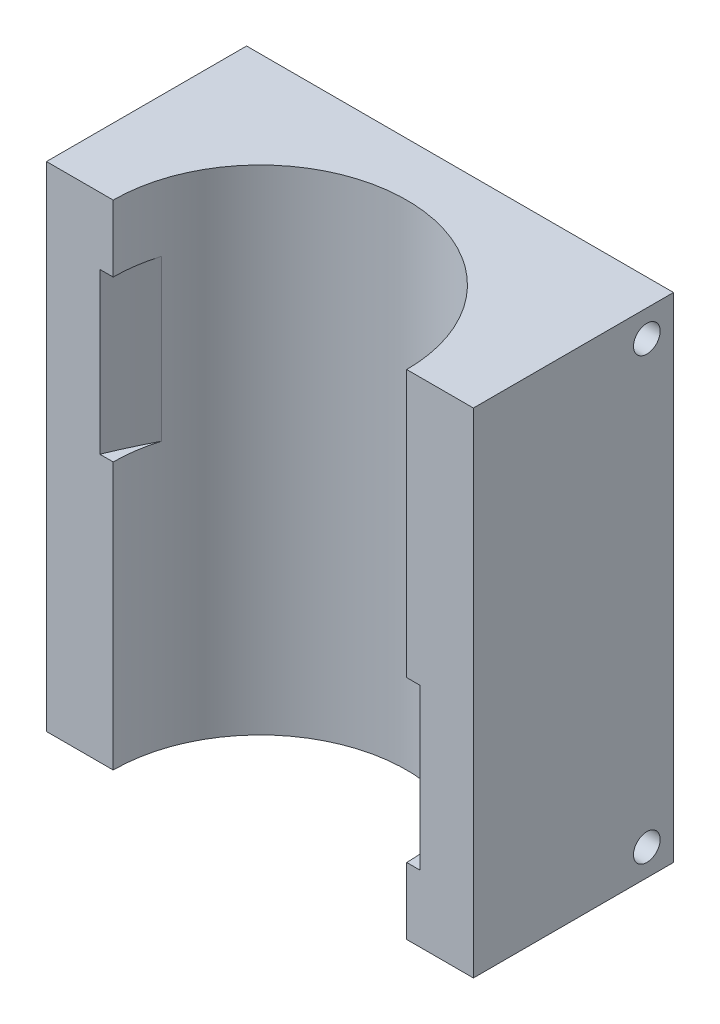
ISO-10303-21;
HEADER;
FILE_DESCRIPTION(('STEP AP214'),'2;1');
FILE_NAME('part.step','',(''),(''),'','','');
FILE_SCHEMA(('AUTOMOTIVE_DESIGN { 1 0 10303 214 1 1 1 1 }'));
ENDSEC;
DATA;
#1=APPLICATION_CONTEXT('core data for automotive mechanical design processes');
#2=APPLICATION_PROTOCOL_DEFINITION('international standard','automotive_design',2000,#1);
#3=PRODUCT_CONTEXT('',#1,'mechanical');
#4=PRODUCT('Part','Part','',(#3));
#5=PRODUCT_RELATED_PRODUCT_CATEGORY('part','',(#4));
#6=PRODUCT_DEFINITION_FORMATION('','',#4);
#7=PRODUCT_DEFINITION_CONTEXT('part definition',#1,'design');
#8=PRODUCT_DEFINITION('design','',#6,#7);
#9=PRODUCT_DEFINITION_SHAPE('','',#8);
#10=(LENGTH_UNIT() NAMED_UNIT(*) SI_UNIT(.MILLI.,.METRE.));
#11=(NAMED_UNIT(*) PLANE_ANGLE_UNIT() SI_UNIT($,.RADIAN.));
#12=(NAMED_UNIT(*) SI_UNIT($,.STERADIAN.) SOLID_ANGLE_UNIT());
#13=UNCERTAINTY_MEASURE_WITH_UNIT(LENGTH_MEASURE(1.E-05),#10,'distance_accuracy_value','');
#14=(GEOMETRIC_REPRESENTATION_CONTEXT(3) GLOBAL_UNCERTAINTY_ASSIGNED_CONTEXT((#13)) GLOBAL_UNIT_ASSIGNED_CONTEXT((#10,
#11,#12)) REPRESENTATION_CONTEXT('',''));
#15=CARTESIAN_POINT('',(0.,0.,0.));
#16=DIRECTION('',(0.,0.,1.));
#17=DIRECTION('',(1.,0.,0.));
#18=AXIS2_PLACEMENT_3D('',#15,#16,#17);
#19=CARTESIAN_POINT('',(0.,30.,-40.));
#20=DIRECTION('',(0.,-1.,0.));
#21=DIRECTION('',(0.,0.,-1.));
#22=AXIS2_PLACEMENT_3D('',#19,#20,#21);
#23=CYLINDRICAL_SURFACE('',#22,11.);
#24=DIRECTION('',(0.,-1.,0.));
#25=VECTOR('',#24,1.);
#26=CARTESIAN_POINT('',(11.,30.,-40.));
#27=LINE('',#26,#25);
#28=CARTESIAN_POINT('',(11.,33.5,-40.));
#29=VERTEX_POINT('',#28);
#30=CARTESIAN_POINT('',(11.,13.5,-40.));
#31=VERTEX_POINT('',#30);
#32=EDGE_CURVE('E192',#29,#31,#27,.T.);
#33=ORIENTED_EDGE('',*,*,#32,.F.);
#34=CARTESIAN_POINT('',(0.,33.5,-40.));
#35=DIRECTION('',(0.,1.,0.));
#36=DIRECTION('',(0.,0.,1.));
#37=AXIS2_PLACEMENT_3D('',#34,#35,#36);
#38=CIRCLE('',#37,11.);
#39=CARTESIAN_POINT('',(-11.,33.5,-40.));
#40=VERTEX_POINT('',#39);
#41=EDGE_CURVE('E146',#29,#40,#38,.T.);
#42=ORIENTED_EDGE('',*,*,#41,.T.);
#43=DIRECTION('',(0.,-1.,0.));
#44=VECTOR('',#43,1.);
#45=CARTESIAN_POINT('',(-11.,30.,-40.));
#46=LINE('',#45,#44);
#47=CARTESIAN_POINT('',(-11.,28.5,-40.));
#48=VERTEX_POINT('',#47);
#49=EDGE_CURVE('E125',#48,#40,#46,.F.);
#50=ORIENTED_EDGE('',*,*,#49,.F.);
#51=CARTESIAN_POINT('',(0.,28.5,-40.));
#52=DIRECTION('',(0.,1.,0.));
#53=DIRECTION('',(0.,0.,1.));
#54=AXIS2_PLACEMENT_3D('',#51,#52,#53);
#55=CIRCLE('',#54,11.);
#56=CARTESIAN_POINT('',(-10.5410845469893,28.5,-43.1441273150468));
#57=VERTEX_POINT('',#56);
#58=EDGE_CURVE('E171',#57,#48,#55,.T.);
#59=ORIENTED_EDGE('',*,*,#58,.F.);
#60=DIRECTION('',(0.,1.,0.));
#61=VECTOR('',#60,1.);
#62=CARTESIAN_POINT('',(-10.5410845469893,16.5,-43.1441273150468));
#63=LINE('',#62,#61);
#64=CARTESIAN_POINT('',(-10.5410845469893,16.5,-43.1441273150468));
#65=VERTEX_POINT('',#64);
#66=EDGE_CURVE('E166',#65,#57,#63,.T.);
#67=ORIENTED_EDGE('',*,*,#66,.F.);
#68=CARTESIAN_POINT('',(0.,16.5,-40.));
#69=DIRECTION('',(0.,1.,0.));
#70=DIRECTION('',(0.,0.,1.));
#71=AXIS2_PLACEMENT_3D('',#68,#69,#70);
#72=CIRCLE('',#71,11.);
#73=CARTESIAN_POINT('',(-11.,16.5,-40.));
#74=VERTEX_POINT('',#73);
#75=EDGE_CURVE('E174',#65,#74,#72,.T.);
#76=ORIENTED_EDGE('',*,*,#75,.T.);
#77=CARTESIAN_POINT('',(-11.,-3.50000000000001,-40.));
#78=VERTEX_POINT('',#77);
#79=EDGE_CURVE('E207',#78,#74,#46,.F.);
#80=ORIENTED_EDGE('',*,*,#79,.F.);
#81=CARTESIAN_POINT('',(0.,-3.50000000000001,-40.));
#82=DIRECTION('',(0.,-1.,0.));
#83=DIRECTION('',(0.,0.,-1.));
#84=AXIS2_PLACEMENT_3D('',#81,#82,#83);
#85=CIRCLE('',#84,11.);
#86=CARTESIAN_POINT('',(11.,-3.50000000000001,-40.));
#87=VERTEX_POINT('',#86);
#88=EDGE_CURVE('E188',#78,#87,#85,.T.);
#89=ORIENTED_EDGE('',*,*,#88,.T.);
#90=CARTESIAN_POINT('',(11.,1.5,-40.));
#91=VERTEX_POINT('',#90);
#92=EDGE_CURVE('E50',#91,#87,#27,.T.);
#93=ORIENTED_EDGE('',*,*,#92,.F.);
#94=CARTESIAN_POINT('',(0.,1.5,-40.));
#95=DIRECTION('',(0.,-1.,0.));
#96=DIRECTION('',(0.,0.,-1.));
#97=AXIS2_PLACEMENT_3D('',#94,#95,#96);
#98=CIRCLE('',#97,11.);
#99=CARTESIAN_POINT('',(10.5410845469893,1.5,-43.1441273150468));
#100=VERTEX_POINT('',#99);
#101=EDGE_CURVE('E43',#100,#91,#98,.T.);
#102=ORIENTED_EDGE('',*,*,#101,.F.);
#103=DIRECTION('',(0.,-1.,0.));
#104=VECTOR('',#103,1.);
#105=CARTESIAN_POINT('',(10.5410845469893,13.5,-43.1441273150468));
#106=LINE('',#105,#104);
#107=CARTESIAN_POINT('',(10.5410845469893,13.5,-43.1441273150468));
#108=VERTEX_POINT('',#107);
#109=EDGE_CURVE('E157',#108,#100,#106,.T.);
#110=ORIENTED_EDGE('',*,*,#109,.F.);
#111=CARTESIAN_POINT('',(0.,13.5,-40.));
#112=DIRECTION('',(0.,-1.,0.));
#113=DIRECTION('',(0.,0.,-1.));
#114=AXIS2_PLACEMENT_3D('',#111,#112,#113);
#115=CIRCLE('',#114,11.);
#116=EDGE_CURVE('E11',#108,#31,#115,.T.);
#117=ORIENTED_EDGE('',*,*,#116,.T.);
#118=EDGE_LOOP('',(#33,#42,#50,#59,#67,#76,#80,#89,#93,#102,#110,#117));
#119=FACE_BOUND('',#118,.T.);
#120=ADVANCED_FACE('F35',(#119),#23,.F.);
#121=CARTESIAN_POINT('',(-16.,30.,-53.5));
#122=DIRECTION('',(1.,0.,0.));
#123=DIRECTION('',(0.,0.,-1.));
#124=AXIS2_PLACEMENT_3D('',#121,#122,#123);
#125=PLANE('',#124);
#126=CARTESIAN_POINT('',(-16.,-1.50000000000001,-53.));
#127=DIRECTION('',(1.,0.,0.));
#128=DIRECTION('',(0.,0.,-1.));
#129=AXIS2_PLACEMENT_3D('',#126,#127,#128);
#130=CIRCLE('',#129,0.999999999999998);
#131=CARTESIAN_POINT('',(-16.,-1.50000000000001,-54.));
#132=VERTEX_POINT('',#131);
#133=EDGE_CURVE('E209',#132,#132,#130,.T.);
#134=ORIENTED_EDGE('',*,*,#133,.T.);
#135=EDGE_LOOP('',(#134));
#136=FACE_BOUND('',#135,.T.);
#137=CARTESIAN_POINT('',(-16.,31.5,-53.));
#138=DIRECTION('',(1.,0.,0.));
#139=DIRECTION('',(0.,0.,-1.));
#140=AXIS2_PLACEMENT_3D('',#137,#138,#139);
#141=CIRCLE('',#140,0.999999999999998);
#142=CARTESIAN_POINT('',(-16.,31.5,-54.));
#143=VERTEX_POINT('',#142);
#144=EDGE_CURVE('E216',#143,#143,#141,.T.);
#145=ORIENTED_EDGE('',*,*,#144,.T.);
#146=EDGE_LOOP('',(#145));
#147=FACE_BOUND('',#146,.T.);
#148=DIRECTION('',(0.,0.,-1.));
#149=VECTOR('',#148,1.);
#150=CARTESIAN_POINT('',(-16.,-3.50000000000001,-26.5));
#151=LINE('',#150,#149);
#152=CARTESIAN_POINT('',(-16.,-3.50000000000001,-40.));
#153=VERTEX_POINT('',#152);
#154=CARTESIAN_POINT('',(-16.,-3.50000000000001,-55.));
#155=VERTEX_POINT('',#154);
#156=EDGE_CURVE('E137',#153,#155,#151,.T.);
#157=ORIENTED_EDGE('',*,*,#156,.F.);
#158=DIRECTION('',(0.,-1.,0.));
#159=VECTOR('',#158,1.);
#160=CARTESIAN_POINT('',(-16.,33.5,-40.));
#161=LINE('',#160,#159);
#162=CARTESIAN_POINT('',(-16.,33.5,-40.));
#163=VERTEX_POINT('',#162);
#164=EDGE_CURVE('E58',#163,#153,#161,.T.);
#165=ORIENTED_EDGE('',*,*,#164,.F.);
#166=DIRECTION('',(0.,0.,1.));
#167=VECTOR('',#166,1.);
#168=CARTESIAN_POINT('',(-16.,33.5,-53.5));
#169=LINE('',#168,#167);
#170=CARTESIAN_POINT('',(-16.,33.5,-55.));
#171=VERTEX_POINT('',#170);
#172=EDGE_CURVE('E135',#171,#163,#169,.T.);
#173=ORIENTED_EDGE('',*,*,#172,.F.);
#174=DIRECTION('',(0.,1.,0.));
#175=VECTOR('',#174,1.);
#176=CARTESIAN_POINT('',(-16.,-3.50000000000001,-55.));
#177=LINE('',#176,#175);
#178=EDGE_CURVE('E228',#155,#171,#177,.T.);
#179=ORIENTED_EDGE('',*,*,#178,.F.);
#180=EDGE_LOOP('',(#157,#165,#173,#179));
#181=FACE_BOUND('',#180,.T.);
#182=ADVANCED_FACE('F37',(#136,#147,#181),#125,.F.);
#183=CARTESIAN_POINT('',(16.,30.,-53.5));
#184=DIRECTION('',(-1.,0.,0.));
#185=DIRECTION('',(0.,0.,1.));
#186=AXIS2_PLACEMENT_3D('',#183,#184,#185);
#187=PLANE('',#186);
#188=CARTESIAN_POINT('',(16.,-1.50000000000001,-53.));
#189=DIRECTION('',(1.,0.,0.));
#190=DIRECTION('',(0.,0.,-1.));
#191=AXIS2_PLACEMENT_3D('',#188,#189,#190);
#192=CIRCLE('',#191,0.999999999999998);
#193=CARTESIAN_POINT('',(16.,-1.50000000000001,-54.));
#194=VERTEX_POINT('',#193);
#195=EDGE_CURVE('E213',#194,#194,#192,.T.);
#196=ORIENTED_EDGE('',*,*,#195,.F.);
#197=EDGE_LOOP('',(#196));
#198=FACE_BOUND('',#197,.T.);
#199=CARTESIAN_POINT('',(16.,31.5,-53.));
#200=DIRECTION('',(1.,0.,0.));
#201=DIRECTION('',(0.,0.,-1.));
#202=AXIS2_PLACEMENT_3D('',#199,#200,#201);
#203=CIRCLE('',#202,0.999999999999998);
#204=CARTESIAN_POINT('',(16.,31.5,-54.));
#205=VERTEX_POINT('',#204);
#206=EDGE_CURVE('E212',#205,#205,#203,.T.);
#207=ORIENTED_EDGE('',*,*,#206,.F.);
#208=EDGE_LOOP('',(#207));
#209=FACE_BOUND('',#208,.T.);
#210=DIRECTION('',(0.,0.,-1.));
#211=VECTOR('',#210,1.);
#212=CARTESIAN_POINT('',(16.,33.5,-26.5));
#213=LINE('',#212,#211);
#214=CARTESIAN_POINT('',(16.,33.5,-40.));
#215=VERTEX_POINT('',#214);
#216=CARTESIAN_POINT('',(16.,33.5,-55.));
#217=VERTEX_POINT('',#216);
#218=EDGE_CURVE('E145',#215,#217,#213,.T.);
#219=ORIENTED_EDGE('',*,*,#218,.F.);
#220=DIRECTION('',(0.,-1.,0.));
#221=VECTOR('',#220,1.);
#222=CARTESIAN_POINT('',(16.,33.5,-40.));
#223=LINE('',#222,#221);
#224=CARTESIAN_POINT('',(16.,-3.50000000000001,-40.));
#225=VERTEX_POINT('',#224);
#226=EDGE_CURVE('E138',#215,#225,#223,.T.);
#227=ORIENTED_EDGE('',*,*,#226,.T.);
#228=DIRECTION('',(0.,0.,1.));
#229=VECTOR('',#228,1.);
#230=CARTESIAN_POINT('',(16.,-3.50000000000001,-53.5));
#231=LINE('',#230,#229);
#232=CARTESIAN_POINT('',(16.,-3.50000000000001,-55.));
#233=VERTEX_POINT('',#232);
#234=EDGE_CURVE('E150',#233,#225,#231,.T.);
#235=ORIENTED_EDGE('',*,*,#234,.F.);
#236=DIRECTION('',(0.,-1.,0.));
#237=VECTOR('',#236,1.);
#238=CARTESIAN_POINT('',(16.,33.5,-55.));
#239=LINE('',#238,#237);
#240=EDGE_CURVE('E222',#217,#233,#239,.T.);
#241=ORIENTED_EDGE('',*,*,#240,.F.);
#242=EDGE_LOOP('',(#219,#227,#235,#241));
#243=FACE_BOUND('',#242,.T.);
#244=ADVANCED_FACE('F240',(#198,#209,#243),#187,.F.);
#245=CARTESIAN_POINT('',(24.9601132838557,16.5,-24.7141258886984));
#246=DIRECTION('',(0.,1.,0.));
#247=DIRECTION('',(0.,0.,1.));
#248=AXIS2_PLACEMENT_3D('',#245,#246,#247);
#249=CYLINDRICAL_SURFACE('',#248,40.);
#250=CARTESIAN_POINT('',(24.9601132838557,28.5,-24.7141258886984));
#251=DIRECTION('',(0.,1.,0.));
#252=DIRECTION('',(0.,0.,1.));
#253=AXIS2_PLACEMENT_3D('',#250,#251,#252);
#254=CIRCLE('',#253,40.);
#255=CARTESIAN_POINT('',(-12.0039510577915,28.5,-40.));
#256=VERTEX_POINT('',#255);
#257=EDGE_CURVE('E162',#57,#256,#254,.T.);
#258=ORIENTED_EDGE('',*,*,#257,.T.);
#259=DIRECTION('',(0.,1.,0.));
#260=VECTOR('',#259,1.);
#261=CARTESIAN_POINT('',(-12.0039510577915,16.5,-40.));
#262=LINE('',#261,#260);
#263=CARTESIAN_POINT('',(-12.0039510577915,16.5,-40.));
#264=VERTEX_POINT('',#263);
#265=EDGE_CURVE('E199',#256,#264,#262,.F.);
#266=ORIENTED_EDGE('',*,*,#265,.T.);
#267=CARTESIAN_POINT('',(24.9601132838557,16.5,-24.7141258886984));
#268=DIRECTION('',(0.,1.,0.));
#269=DIRECTION('',(0.,0.,1.));
#270=AXIS2_PLACEMENT_3D('',#267,#268,#269);
#271=CIRCLE('',#270,40.);
#272=EDGE_CURVE('E163',#65,#264,#271,.T.);
#273=ORIENTED_EDGE('',*,*,#272,.F.);
#274=ORIENTED_EDGE('',*,*,#66,.T.);
#275=EDGE_LOOP('',(#258,#266,#273,#274));
#276=FACE_BOUND('',#275,.T.);
#277=ADVANCED_FACE('F263',(#276),#249,.F.);
#278=CARTESIAN_POINT('',(24.9601132838557,16.5,-24.7141258886984));
#279=DIRECTION('',(0.,1.,0.));
#280=DIRECTION('',(0.,0.,1.));
#281=AXIS2_PLACEMENT_3D('',#278,#279,#280);
#282=PLANE('',#281);
#283=DIRECTION('',(-1.,0.,0.));
#284=VECTOR('',#283,1.);
#285=CARTESIAN_POINT('',(24.9601132838557,16.5,-40.));
#286=LINE('',#285,#284);
#287=EDGE_CURVE('E206',#74,#264,#286,.T.);
#288=ORIENTED_EDGE('',*,*,#287,.F.);
#289=ORIENTED_EDGE('',*,*,#75,.F.);
#290=ORIENTED_EDGE('',*,*,#272,.T.);
#291=EDGE_LOOP('',(#288,#289,#290));
#292=FACE_BOUND('',#291,.T.);
#293=ADVANCED_FACE('F270',(#292),#282,.T.);
#294=CARTESIAN_POINT('',(24.9601132838557,28.5,-24.7141258886984));
#295=DIRECTION('',(0.,1.,0.));
#296=DIRECTION('',(0.,0.,1.));
#297=AXIS2_PLACEMENT_3D('',#294,#295,#296);
#298=PLANE('',#297);
#299=ORIENTED_EDGE('',*,*,#58,.T.);
#300=DIRECTION('',(-1.,0.,0.));
#301=VECTOR('',#300,1.);
#302=CARTESIAN_POINT('',(24.9601132838557,28.5,-40.));
#303=LINE('',#302,#301);
#304=EDGE_CURVE('E196',#48,#256,#303,.T.);
#305=ORIENTED_EDGE('',*,*,#304,.T.);
#306=ORIENTED_EDGE('',*,*,#257,.F.);
#307=EDGE_LOOP('',(#299,#305,#306));
#308=FACE_BOUND('',#307,.T.);
#309=ADVANCED_FACE('F329',(#308),#298,.F.);
#310=CARTESIAN_POINT('',(-24.9601132838557,13.5,-24.7141258886984));
#311=DIRECTION('',(0.,-1.,0.));
#312=DIRECTION('',(0.,0.,-1.));
#313=AXIS2_PLACEMENT_3D('',#310,#311,#312);
#314=CYLINDRICAL_SURFACE('',#313,40.);
#315=CARTESIAN_POINT('',(-24.9601132838557,1.5,-24.7141258886984));
#316=DIRECTION('',(0.,-1.,0.));
#317=DIRECTION('',(0.,0.,1.));
#318=AXIS2_PLACEMENT_3D('',#315,#316,#317);
#319=CIRCLE('',#318,40.);
#320=CARTESIAN_POINT('',(12.0039510577915,1.5,-40.));
#321=VERTEX_POINT('',#320);
#322=EDGE_CURVE('E148',#100,#321,#319,.T.);
#323=ORIENTED_EDGE('',*,*,#322,.T.);
#324=DIRECTION('',(0.,-1.,0.));
#325=VECTOR('',#324,1.);
#326=CARTESIAN_POINT('',(12.0039510577915,13.5,-40.));
#327=LINE('',#326,#325);
#328=CARTESIAN_POINT('',(12.0039510577915,13.5,-40.));
#329=VERTEX_POINT('',#328);
#330=EDGE_CURVE('E190',#321,#329,#327,.F.);
#331=ORIENTED_EDGE('',*,*,#330,.T.);
#332=CARTESIAN_POINT('',(-24.9601132838557,13.5,-24.7141258886984));
#333=DIRECTION('',(0.,-1.,0.));
#334=DIRECTION('',(0.,0.,1.));
#335=AXIS2_PLACEMENT_3D('',#332,#333,#334);
#336=CIRCLE('',#335,40.);
#337=EDGE_CURVE('E154',#108,#329,#336,.T.);
#338=ORIENTED_EDGE('',*,*,#337,.F.);
#339=ORIENTED_EDGE('',*,*,#109,.T.);
#340=EDGE_LOOP('',(#323,#331,#338,#339));
#341=FACE_BOUND('',#340,.T.);
#342=ADVANCED_FACE('F321',(#341),#314,.F.);
#343=CARTESIAN_POINT('',(-24.9601132838557,13.5,-24.7141258886984));
#344=DIRECTION('',(0.,-1.,0.));
#345=DIRECTION('',(0.,0.,1.));
#346=AXIS2_PLACEMENT_3D('',#343,#344,#345);
#347=PLANE('',#346);
#348=DIRECTION('',(1.,0.,0.));
#349=VECTOR('',#348,1.);
#350=CARTESIAN_POINT('',(-24.9601132838557,13.5,-40.));
#351=LINE('',#350,#349);
#352=EDGE_CURVE('E189',#31,#329,#351,.T.);
#353=ORIENTED_EDGE('',*,*,#352,.F.);
#354=ORIENTED_EDGE('',*,*,#116,.F.);
#355=ORIENTED_EDGE('',*,*,#337,.T.);
#356=EDGE_LOOP('',(#353,#354,#355));
#357=FACE_BOUND('',#356,.T.);
#358=ADVANCED_FACE('F314',(#357),#347,.T.);
#359=CARTESIAN_POINT('',(-24.9601132838557,1.5,-24.7141258886984));
#360=DIRECTION('',(0.,-1.,0.));
#361=DIRECTION('',(0.,0.,1.));
#362=AXIS2_PLACEMENT_3D('',#359,#360,#361);
#363=PLANE('',#362);
#364=ORIENTED_EDGE('',*,*,#101,.T.);
#365=DIRECTION('',(1.,0.,0.));
#366=VECTOR('',#365,1.);
#367=CARTESIAN_POINT('',(-24.9601132838557,1.5,-40.));
#368=LINE('',#367,#366);
#369=EDGE_CURVE('E181',#91,#321,#368,.T.);
#370=ORIENTED_EDGE('',*,*,#369,.T.);
#371=ORIENTED_EDGE('',*,*,#322,.F.);
#372=EDGE_LOOP('',(#364,#370,#371));
#373=FACE_BOUND('',#372,.T.);
#374=ADVANCED_FACE('F180',(#373),#363,.F.);
#375=CARTESIAN_POINT('',(0.,33.5,-40.));
#376=DIRECTION('',(0.,1.,0.));
#377=DIRECTION('',(0.,0.,1.));
#378=AXIS2_PLACEMENT_3D('',#375,#376,#377);
#379=PLANE('',#378);
#380=DIRECTION('',(1.,0.,0.));
#381=VECTOR('',#380,1.);
#382=CARTESIAN_POINT('',(-16.,33.5,-40.));
#383=LINE('',#382,#381);
#384=EDGE_CURVE('E130',#29,#215,#383,.T.);
#385=ORIENTED_EDGE('',*,*,#384,.T.);
#386=ORIENTED_EDGE('',*,*,#218,.T.);
#387=DIRECTION('',(1.,0.,0.));
#388=VECTOR('',#387,1.);
#389=CARTESIAN_POINT('',(-16.,33.5,-55.));
#390=LINE('',#389,#388);
#391=EDGE_CURVE('E144',#171,#217,#390,.T.);
#392=ORIENTED_EDGE('',*,*,#391,.F.);
#393=ORIENTED_EDGE('',*,*,#172,.T.);
#394=EDGE_CURVE('E122',#163,#40,#383,.T.);
#395=ORIENTED_EDGE('',*,*,#394,.T.);
#396=ORIENTED_EDGE('',*,*,#41,.F.);
#397=EDGE_LOOP('',(#385,#386,#392,#393,#395,#396));
#398=FACE_BOUND('',#397,.T.);
#399=ADVANCED_FACE('F142',(#398),#379,.T.);
#400=CARTESIAN_POINT('',(0.,-3.50000000000001,-40.));
#401=DIRECTION('',(0.,-1.,0.));
#402=DIRECTION('',(0.,0.,-1.));
#403=AXIS2_PLACEMENT_3D('',#400,#401,#402);
#404=PLANE('',#403);
#405=DIRECTION('',(1.,0.,0.));
#406=VECTOR('',#405,1.);
#407=CARTESIAN_POINT('',(-16.,-3.50000000000001,-40.));
#408=LINE('',#407,#406);
#409=EDGE_CURVE('E514',#153,#78,#408,.T.);
#410=ORIENTED_EDGE('',*,*,#409,.F.);
#411=ORIENTED_EDGE('',*,*,#156,.T.);
#412=DIRECTION('',(-1.,0.,0.));
#413=VECTOR('',#412,1.);
#414=CARTESIAN_POINT('',(16.,-3.50000000000001,-55.));
#415=LINE('',#414,#413);
#416=EDGE_CURVE('E225',#233,#155,#415,.T.);
#417=ORIENTED_EDGE('',*,*,#416,.F.);
#418=ORIENTED_EDGE('',*,*,#234,.T.);
#419=EDGE_CURVE('E235',#87,#225,#408,.T.);
#420=ORIENTED_EDGE('',*,*,#419,.F.);
#421=ORIENTED_EDGE('',*,*,#88,.F.);
#422=EDGE_LOOP('',(#410,#411,#417,#418,#420,#421));
#423=FACE_BOUND('',#422,.T.);
#424=ADVANCED_FACE('F234',(#423),#404,.T.);
#425=CARTESIAN_POINT('',(0.,0.,-55.));
#426=DIRECTION('',(0.,0.,-1.));
#427=DIRECTION('',(-1.,0.,0.));
#428=AXIS2_PLACEMENT_3D('',#425,#426,#427);
#429=PLANE('',#428);
#430=ORIENTED_EDGE('',*,*,#391,.T.);
#431=ORIENTED_EDGE('',*,*,#240,.T.);
#432=ORIENTED_EDGE('',*,*,#416,.T.);
#433=ORIENTED_EDGE('',*,*,#178,.T.);
#434=EDGE_LOOP('',(#430,#431,#432,#433));
#435=FACE_BOUND('',#434,.T.);
#436=ADVANCED_FACE('F242',(#435),#429,.T.);
#437=CARTESIAN_POINT('',(-16.,31.5,-53.));
#438=DIRECTION('',(1.,0.,0.));
#439=DIRECTION('',(0.,0.,-1.));
#440=AXIS2_PLACEMENT_3D('',#437,#438,#439);
#441=CYLINDRICAL_SURFACE('',#440,0.999999999999998);
#442=ORIENTED_EDGE('',*,*,#144,.F.);
#443=EDGE_LOOP('',(#442));
#444=FACE_BOUND('',#443,.T.);
#445=ORIENTED_EDGE('',*,*,#206,.T.);
#446=EDGE_LOOP('',(#445));
#447=FACE_BOUND('',#446,.T.);
#448=ADVANCED_FACE('F244',(#444,#447),#441,.F.);
#449=CARTESIAN_POINT('',(-16.,-1.50000000000001,-53.));
#450=DIRECTION('',(1.,0.,0.));
#451=DIRECTION('',(0.,0.,-1.));
#452=AXIS2_PLACEMENT_3D('',#449,#450,#451);
#453=CYLINDRICAL_SURFACE('',#452,0.999999999999998);
#454=ORIENTED_EDGE('',*,*,#133,.F.);
#455=EDGE_LOOP('',(#454));
#456=FACE_BOUND('',#455,.T.);
#457=ORIENTED_EDGE('',*,*,#195,.T.);
#458=EDGE_LOOP('',(#457));
#459=FACE_BOUND('',#458,.T.);
#460=ADVANCED_FACE('F250',(#456,#459),#453,.F.);
#461=CARTESIAN_POINT('',(-16.,33.5,-40.));
#462=DIRECTION('',(0.,0.,-1.));
#463=DIRECTION('',(-1.,0.,0.));
#464=AXIS2_PLACEMENT_3D('',#461,#462,#463);
#465=PLANE('',#464);
#466=ORIENTED_EDGE('',*,*,#32,.T.);
#467=ORIENTED_EDGE('',*,*,#352,.T.);
#468=ORIENTED_EDGE('',*,*,#330,.F.);
#469=ORIENTED_EDGE('',*,*,#369,.F.);
#470=ORIENTED_EDGE('',*,*,#92,.T.);
#471=ORIENTED_EDGE('',*,*,#419,.T.);
#472=ORIENTED_EDGE('',*,*,#226,.F.);
#473=ORIENTED_EDGE('',*,*,#384,.F.);
#474=EDGE_LOOP('',(#466,#467,#468,#469,#470,#471,#472,#473));
#475=FACE_BOUND('',#474,.T.);
#476=ADVANCED_FACE('F278',(#475),#465,.F.);
#477=ORIENTED_EDGE('',*,*,#79,.T.);
#478=ORIENTED_EDGE('',*,*,#287,.T.);
#479=ORIENTED_EDGE('',*,*,#265,.F.);
#480=ORIENTED_EDGE('',*,*,#304,.F.);
#481=ORIENTED_EDGE('',*,*,#49,.T.);
#482=ORIENTED_EDGE('',*,*,#394,.F.);
#483=ORIENTED_EDGE('',*,*,#164,.T.);
#484=ORIENTED_EDGE('',*,*,#409,.T.);
#485=EDGE_LOOP('',(#477,#478,#479,#480,#481,#482,#483,#484));
#486=FACE_BOUND('',#485,.T.);
#487=ADVANCED_FACE('F123',(#486),#465,.F.);
#488=CLOSED_SHELL('',(#120,#182,#244,#277,#293,#309,#342,#358,#374,#399,#424,#436,#448,#460,
#476,#487));
#489=MANIFOLD_SOLID_BREP('B2',#488);
#490=ADVANCED_BREP_SHAPE_REPRESENTATION('',(#18,#489),#14);
#491=SHAPE_DEFINITION_REPRESENTATION(#9,#490);
ENDSEC;
END-ISO-10303-21;
